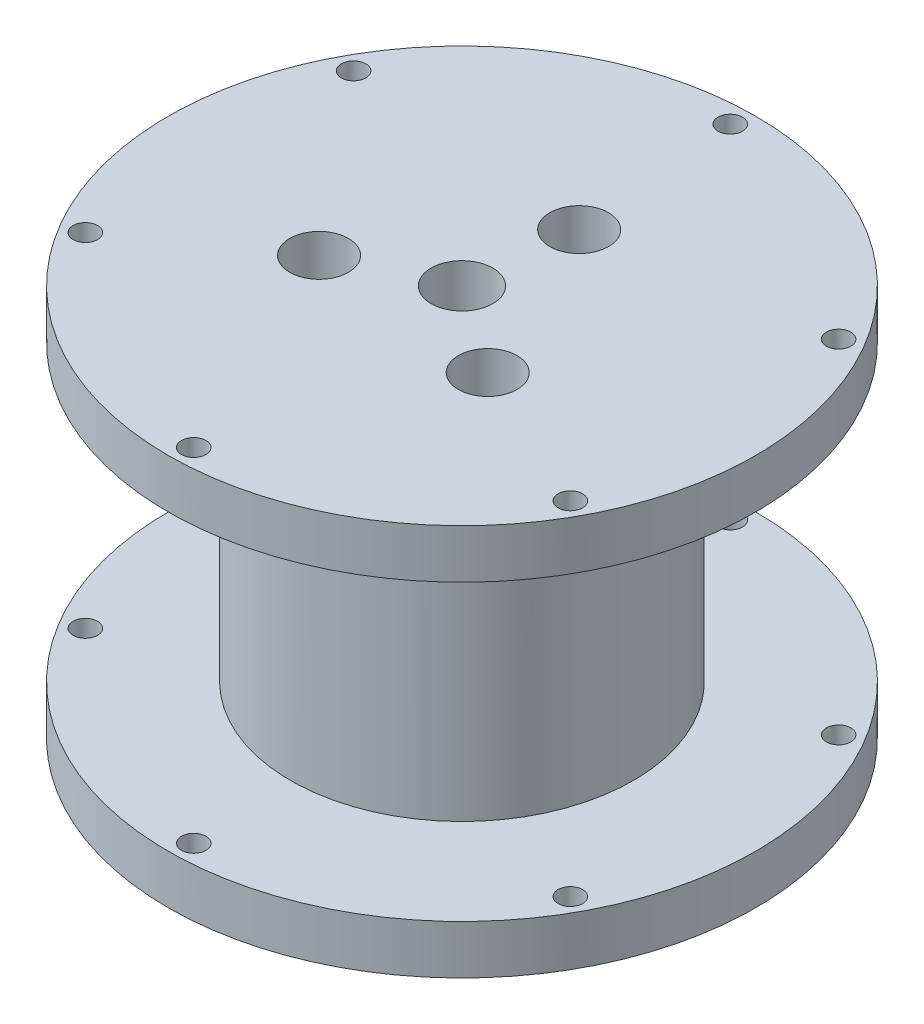
ISO-10303-21;
HEADER;
FILE_DESCRIPTION(('STEP AP214'),'2;1');
FILE_NAME('part.step','',(''),(''),'','','');
FILE_SCHEMA(('AUTOMOTIVE_DESIGN { 1 0 10303 214 1 1 1 1 }'));
ENDSEC;
DATA;
#1=APPLICATION_CONTEXT('core data for automotive mechanical design processes');
#2=APPLICATION_PROTOCOL_DEFINITION('international standard','automotive_design',2000,#1);
#3=PRODUCT_CONTEXT('',#1,'mechanical');
#4=PRODUCT('Part','Part','',(#3));
#5=PRODUCT_RELATED_PRODUCT_CATEGORY('part','',(#4));
#6=PRODUCT_DEFINITION_FORMATION('','',#4);
#7=PRODUCT_DEFINITION_CONTEXT('part definition',#1,'design');
#8=PRODUCT_DEFINITION('design','',#6,#7);
#9=PRODUCT_DEFINITION_SHAPE('','',#8);
#10=(LENGTH_UNIT() NAMED_UNIT(*) SI_UNIT(.MILLI.,.METRE.));
#11=(NAMED_UNIT(*) PLANE_ANGLE_UNIT() SI_UNIT($,.RADIAN.));
#12=(NAMED_UNIT(*) SI_UNIT($,.STERADIAN.) SOLID_ANGLE_UNIT());
#13=UNCERTAINTY_MEASURE_WITH_UNIT(LENGTH_MEASURE(1.E-05),#10,'distance_accuracy_value','');
#14=(GEOMETRIC_REPRESENTATION_CONTEXT(3) GLOBAL_UNCERTAINTY_ASSIGNED_CONTEXT((#13)) GLOBAL_UNIT_ASSIGNED_CONTEXT((#10,
#11,#12)) REPRESENTATION_CONTEXT('',''));
#15=CARTESIAN_POINT('',(0.,0.,0.));
#16=DIRECTION('',(0.,0.,1.));
#17=DIRECTION('',(1.,0.,0.));
#18=AXIS2_PLACEMENT_3D('',#15,#16,#17);
#19=CARTESIAN_POINT('',(0.,40.,0.));
#20=DIRECTION('',(0.,-1.,0.));
#21=DIRECTION('',(0.,0.,-1.));
#22=AXIS2_PLACEMENT_3D('',#19,#20,#21);
#23=CYLINDRICAL_SURFACE('',#22,3.15);
#24=CARTESIAN_POINT('',(0.,40.,0.));
#25=DIRECTION('',(0.,-1.,0.));
#26=DIRECTION('',(0.,0.,-1.));
#27=AXIS2_PLACEMENT_3D('',#24,#25,#26);
#28=CIRCLE('',#27,3.15);
#29=CARTESIAN_POINT('',(0.,40.,-3.15));
#30=VERTEX_POINT('',#29);
#31=EDGE_CURVE('E181',#30,#30,#28,.T.);
#32=ORIENTED_EDGE('',*,*,#31,.F.);
#33=EDGE_LOOP('',(#32));
#34=FACE_BOUND('',#33,.T.);
#35=CARTESIAN_POINT('',(0.,7.5,0.));
#36=DIRECTION('',(0.,-1.,0.));
#37=DIRECTION('',(0.,0.,-1.));
#38=AXIS2_PLACEMENT_3D('',#35,#36,#37);
#39=CIRCLE('',#38,3.15);
#40=CARTESIAN_POINT('',(0.,7.5,-3.15));
#41=VERTEX_POINT('',#40);
#42=EDGE_CURVE('E159',#41,#41,#39,.F.);
#43=ORIENTED_EDGE('',*,*,#42,.F.);
#44=EDGE_LOOP('',(#43));
#45=FACE_BOUND('',#44,.T.);
#46=ADVANCED_FACE('F36',(#34,#45),#23,.F.);
#47=CARTESIAN_POINT('',(0.,40.,0.));
#48=DIRECTION('',(0.,-1.,0.));
#49=DIRECTION('',(0.,0.,-1.));
#50=AXIS2_PLACEMENT_3D('',#47,#48,#49);
#51=CYLINDRICAL_SURFACE('',#50,30.);
#52=CARTESIAN_POINT('',(0.,40.,0.));
#53=DIRECTION('',(0.,1.,0.));
#54=DIRECTION('',(0.,0.,1.));
#55=AXIS2_PLACEMENT_3D('',#52,#53,#54);
#56=CIRCLE('',#55,30.);
#57=CARTESIAN_POINT('',(0.,40.,30.));
#58=VERTEX_POINT('',#57);
#59=EDGE_CURVE('E205',#58,#58,#56,.T.);
#60=ORIENTED_EDGE('',*,*,#59,.F.);
#61=EDGE_LOOP('',(#60));
#62=FACE_BOUND('',#61,.T.);
#63=CARTESIAN_POINT('',(0.,35.,0.));
#64=DIRECTION('',(0.,-1.,0.));
#65=DIRECTION('',(0.,0.,-1.));
#66=AXIS2_PLACEMENT_3D('',#63,#64,#65);
#67=CIRCLE('',#66,30.);
#68=CARTESIAN_POINT('',(0.,35.,-30.));
#69=VERTEX_POINT('',#68);
#70=EDGE_CURVE('E212',#69,#69,#67,.T.);
#71=ORIENTED_EDGE('',*,*,#70,.F.);
#72=EDGE_LOOP('',(#71));
#73=FACE_BOUND('',#72,.T.);
#74=ADVANCED_FACE('F249',(#62,#73),#51,.T.);
#75=CARTESIAN_POINT('',(0.,40.,0.));
#76=DIRECTION('',(0.,1.,0.));
#77=DIRECTION('',(0.,0.,1.));
#78=AXIS2_PLACEMENT_3D('',#75,#76,#77);
#79=PLANE('',#78);
#80=CARTESIAN_POINT('',(23.9426736674736,40.,-14.517175264247));
#81=DIRECTION('',(0.,-1.,0.));
#82=DIRECTION('',(0.,0.,-1.));
#83=AXIS2_PLACEMENT_3D('',#80,#81,#82);
#84=CIRCLE('',#83,1.25);
#85=CARTESIAN_POINT('',(23.9426736674736,40.,-15.767175264247));
#86=VERTEX_POINT('',#85);
#87=EDGE_CURVE('E499',#86,#86,#84,.T.);
#88=ORIENTED_EDGE('',*,*,#87,.T.);
#89=EDGE_LOOP('',(#88));
#90=FACE_BOUND('',#89,.T.);
#91=CARTESIAN_POINT('',(-0.600905736292166,40.,-27.9935512626764));
#92=DIRECTION('',(0.,-1.,0.));
#93=DIRECTION('',(0.,0.,-1.));
#94=AXIS2_PLACEMENT_3D('',#91,#92,#93);
#95=CIRCLE('',#94,1.25);
#96=CARTESIAN_POINT('',(-0.600905736292166,40.,-29.2435512626764));
#97=VERTEX_POINT('',#96);
#98=EDGE_CURVE('E500',#97,#97,#95,.T.);
#99=ORIENTED_EDGE('',*,*,#98,.T.);
#100=EDGE_LOOP('',(#99));
#101=FACE_BOUND('',#100,.T.);
#102=CARTESIAN_POINT('',(-24.5435794037658,40.,-13.4763759984294));
#103=DIRECTION('',(0.,-1.,0.));
#104=DIRECTION('',(0.,0.,-1.));
#105=AXIS2_PLACEMENT_3D('',#102,#103,#104);
#106=CIRCLE('',#105,1.25);
#107=CARTESIAN_POINT('',(-24.5435794037658,40.,-14.7263759984294));
#108=VERTEX_POINT('',#107);
#109=EDGE_CURVE('E503',#108,#108,#106,.T.);
#110=ORIENTED_EDGE('',*,*,#109,.T.);
#111=EDGE_LOOP('',(#110));
#112=FACE_BOUND('',#111,.T.);
#113=CARTESIAN_POINT('',(-23.9426736674736,40.,14.517175264247));
#114=DIRECTION('',(0.,-1.,0.));
#115=DIRECTION('',(0.,0.,-1.));
#116=AXIS2_PLACEMENT_3D('',#113,#114,#115);
#117=CIRCLE('',#116,1.25);
#118=CARTESIAN_POINT('',(-23.9426736674736,40.,13.267175264247));
#119=VERTEX_POINT('',#118);
#120=EDGE_CURVE('E626',#119,#119,#117,.T.);
#121=ORIENTED_EDGE('',*,*,#120,.T.);
#122=EDGE_LOOP('',(#121));
#123=FACE_BOUND('',#122,.T.);
#124=CARTESIAN_POINT('',(0.600905736292153,40.,27.9935512626764));
#125=DIRECTION('',(0.,-1.,0.));
#126=DIRECTION('',(0.,0.,-1.));
#127=AXIS2_PLACEMENT_3D('',#124,#125,#126);
#128=CIRCLE('',#127,1.25);
#129=CARTESIAN_POINT('',(0.600905736292153,40.,26.7435512626764));
#130=VERTEX_POINT('',#129);
#131=EDGE_CURVE('E511',#130,#130,#128,.T.);
#132=ORIENTED_EDGE('',*,*,#131,.T.);
#133=EDGE_LOOP('',(#132));
#134=FACE_BOUND('',#133,.T.);
#135=CARTESIAN_POINT('',(24.5435794037658,40.,13.4763759984294));
#136=DIRECTION('',(0.,-1.,0.));
#137=DIRECTION('',(0.,0.,-1.));
#138=AXIS2_PLACEMENT_3D('',#135,#136,#137);
#139=CIRCLE('',#138,1.25);
#140=CARTESIAN_POINT('',(24.5435794037658,40.,12.2263759984294));
#141=VERTEX_POINT('',#140);
#142=EDGE_CURVE('E507',#141,#141,#139,.T.);
#143=ORIENTED_EDGE('',*,*,#142,.T.);
#144=EDGE_LOOP('',(#143));
#145=FACE_BOUND('',#144,.T.);
#146=CARTESIAN_POINT('',(1.01025077865064,40.,-10.9535105497843));
#147=DIRECTION('',(0.,-1.,0.));
#148=DIRECTION('',(0.,0.,-1.));
#149=AXIS2_PLACEMENT_3D('',#146,#147,#148);
#150=CIRCLE('',#149,3.);
#151=CARTESIAN_POINT('',(1.01025077865064,40.,-13.9535105497843));
#152=VERTEX_POINT('',#151);
#153=EDGE_CURVE('E178',#152,#152,#150,.T.);
#154=ORIENTED_EDGE('',*,*,#153,.T.);
#155=EDGE_LOOP('',(#154));
#156=FACE_BOUND('',#155,.T.);
#157=CARTESIAN_POINT('',(8.98089300740874,40.,6.3516581133966));
#158=DIRECTION('',(0.,-1.,0.));
#159=DIRECTION('',(0.,0.,-1.));
#160=AXIS2_PLACEMENT_3D('',#157,#158,#159);
#161=CIRCLE('',#160,3.);
#162=CARTESIAN_POINT('',(8.98089300740874,40.,3.3516581133966));
#163=VERTEX_POINT('',#162);
#164=EDGE_CURVE('E185',#163,#163,#161,.T.);
#165=ORIENTED_EDGE('',*,*,#164,.T.);
#166=EDGE_LOOP('',(#165));
#167=FACE_BOUND('',#166,.T.);
#168=CARTESIAN_POINT('',(-9.99114378605937,40.,4.60185243638768));
#169=DIRECTION('',(0.,-1.,0.));
#170=DIRECTION('',(0.,0.,-1.));
#171=AXIS2_PLACEMENT_3D('',#168,#169,#170);
#172=CIRCLE('',#171,3.);
#173=CARTESIAN_POINT('',(-9.99114378605937,40.,1.60185243638768));
#174=VERTEX_POINT('',#173);
#175=EDGE_CURVE('E191',#174,#174,#172,.T.);
#176=ORIENTED_EDGE('',*,*,#175,.T.);
#177=EDGE_LOOP('',(#176));
#178=FACE_BOUND('',#177,.T.);
#179=ORIENTED_EDGE('',*,*,#31,.T.);
#180=EDGE_LOOP('',(#179));
#181=FACE_BOUND('',#180,.T.);
#182=ORIENTED_EDGE('',*,*,#59,.T.);
#183=EDGE_LOOP('',(#182));
#184=FACE_BOUND('',#183,.T.);
#185=ADVANCED_FACE('F242',(#90,#101,#112,#123,#134,#145,#156,#167,#178,#181,#184),#79,.T.);
#186=CARTESIAN_POINT('',(0.,35.,0.));
#187=DIRECTION('',(0.,-1.,0.));
#188=DIRECTION('',(0.,0.,-1.));
#189=AXIS2_PLACEMENT_3D('',#186,#187,#188);
#190=PLANE('',#189);
#191=CARTESIAN_POINT('',(23.9426736674736,35.,-14.517175264247));
#192=DIRECTION('',(0.,-1.,0.));
#193=DIRECTION('',(0.,0.,-1.));
#194=AXIS2_PLACEMENT_3D('',#191,#192,#193);
#195=CIRCLE('',#194,1.25);
#196=CARTESIAN_POINT('',(23.9426736674736,35.,-15.767175264247));
#197=VERTEX_POINT('',#196);
#198=EDGE_CURVE('E136',#197,#197,#195,.T.);
#199=ORIENTED_EDGE('',*,*,#198,.F.);
#200=EDGE_LOOP('',(#199));
#201=FACE_BOUND('',#200,.T.);
#202=CARTESIAN_POINT('',(-0.600905736292166,35.,-27.9935512626764));
#203=DIRECTION('',(0.,-1.,0.));
#204=DIRECTION('',(0.,0.,-1.));
#205=AXIS2_PLACEMENT_3D('',#202,#203,#204);
#206=CIRCLE('',#205,1.25);
#207=CARTESIAN_POINT('',(-0.600905736292166,35.,-29.2435512626764));
#208=VERTEX_POINT('',#207);
#209=EDGE_CURVE('E543',#208,#208,#206,.T.);
#210=ORIENTED_EDGE('',*,*,#209,.F.);
#211=EDGE_LOOP('',(#210));
#212=FACE_BOUND('',#211,.T.);
#213=CARTESIAN_POINT('',(-24.5435794037658,35.,-13.4763759984294));
#214=DIRECTION('',(0.,-1.,0.));
#215=DIRECTION('',(0.,0.,-1.));
#216=AXIS2_PLACEMENT_3D('',#213,#214,#215);
#217=CIRCLE('',#216,1.25);
#218=CARTESIAN_POINT('',(-24.5435794037658,35.,-14.7263759984294));
#219=VERTEX_POINT('',#218);
#220=EDGE_CURVE('E536',#219,#219,#217,.T.);
#221=ORIENTED_EDGE('',*,*,#220,.F.);
#222=EDGE_LOOP('',(#221));
#223=FACE_BOUND('',#222,.T.);
#224=CARTESIAN_POINT('',(-23.9426736674736,35.,14.517175264247));
#225=DIRECTION('',(0.,-1.,0.));
#226=DIRECTION('',(0.,0.,-1.));
#227=AXIS2_PLACEMENT_3D('',#224,#225,#226);
#228=CIRCLE('',#227,1.25);
#229=CARTESIAN_POINT('',(-23.9426736674736,35.,13.267175264247));
#230=VERTEX_POINT('',#229);
#231=EDGE_CURVE('E529',#230,#230,#228,.T.);
#232=ORIENTED_EDGE('',*,*,#231,.F.);
#233=EDGE_LOOP('',(#232));
#234=FACE_BOUND('',#233,.T.);
#235=CARTESIAN_POINT('',(0.600905736292153,35.,27.9935512626764));
#236=DIRECTION('',(0.,-1.,0.));
#237=DIRECTION('',(0.,0.,-1.));
#238=AXIS2_PLACEMENT_3D('',#235,#236,#237);
#239=CIRCLE('',#238,1.25);
#240=CARTESIAN_POINT('',(0.600905736292153,35.,26.7435512626764));
#241=VERTEX_POINT('',#240);
#242=EDGE_CURVE('E522',#241,#241,#239,.T.);
#243=ORIENTED_EDGE('',*,*,#242,.F.);
#244=EDGE_LOOP('',(#243));
#245=FACE_BOUND('',#244,.T.);
#246=CARTESIAN_POINT('',(24.5435794037658,35.,13.4763759984294));
#247=DIRECTION('',(0.,-1.,0.));
#248=DIRECTION('',(0.,0.,-1.));
#249=AXIS2_PLACEMENT_3D('',#246,#247,#248);
#250=CIRCLE('',#249,1.25);
#251=CARTESIAN_POINT('',(24.5435794037658,35.,12.2263759984294));
#252=VERTEX_POINT('',#251);
#253=EDGE_CURVE('E515',#252,#252,#250,.T.);
#254=ORIENTED_EDGE('',*,*,#253,.F.);
#255=EDGE_LOOP('',(#254));
#256=FACE_BOUND('',#255,.T.);
#257=CARTESIAN_POINT('',(0.,35.,0.));
#258=DIRECTION('',(0.,-1.,0.));
#259=DIRECTION('',(0.,0.,-1.));
#260=AXIS2_PLACEMENT_3D('',#257,#258,#259);
#261=CIRCLE('',#260,17.5);
#262=CARTESIAN_POINT('',(0.,35.,-17.5));
#263=VERTEX_POINT('',#262);
#264=EDGE_CURVE('E199',#263,#263,#261,.T.);
#265=ORIENTED_EDGE('',*,*,#264,.F.);
#266=EDGE_LOOP('',(#265));
#267=FACE_BOUND('',#266,.T.);
#268=ORIENTED_EDGE('',*,*,#70,.T.);
#269=EDGE_LOOP('',(#268));
#270=FACE_BOUND('',#269,.T.);
#271=ADVANCED_FACE('F238',(#201,#212,#223,#234,#245,#256,#267,#270),#190,.T.);
#272=CARTESIAN_POINT('',(0.,5.,0.));
#273=DIRECTION('',(0.,-1.,0.));
#274=DIRECTION('',(0.,0.,-1.));
#275=AXIS2_PLACEMENT_3D('',#272,#273,#274);
#276=PLANE('',#275);
#277=CARTESIAN_POINT('',(23.9426736674736,5.,-14.517175264247));
#278=DIRECTION('',(0.,-1.,0.));
#279=DIRECTION('',(0.,0.,-1.));
#280=AXIS2_PLACEMENT_3D('',#277,#278,#279);
#281=CIRCLE('',#280,1.25);
#282=CARTESIAN_POINT('',(23.9426736674736,5.,-15.767175264247));
#283=VERTEX_POINT('',#282);
#284=EDGE_CURVE('E545',#283,#283,#281,.T.);
#285=ORIENTED_EDGE('',*,*,#284,.T.);
#286=EDGE_LOOP('',(#285));
#287=FACE_BOUND('',#286,.T.);
#288=CARTESIAN_POINT('',(-0.600905736292166,5.,-27.9935512626764));
#289=DIRECTION('',(0.,-1.,0.));
#290=DIRECTION('',(0.,0.,-1.));
#291=AXIS2_PLACEMENT_3D('',#288,#289,#290);
#292=CIRCLE('',#291,1.25);
#293=CARTESIAN_POINT('',(-0.600905736292166,5.,-29.2435512626764));
#294=VERTEX_POINT('',#293);
#295=EDGE_CURVE('E540',#294,#294,#292,.T.);
#296=ORIENTED_EDGE('',*,*,#295,.T.);
#297=EDGE_LOOP('',(#296));
#298=FACE_BOUND('',#297,.T.);
#299=CARTESIAN_POINT('',(-24.5435794037658,5.,-13.4763759984294));
#300=DIRECTION('',(0.,-1.,0.));
#301=DIRECTION('',(0.,0.,-1.));
#302=AXIS2_PLACEMENT_3D('',#299,#300,#301);
#303=CIRCLE('',#302,1.25);
#304=CARTESIAN_POINT('',(-24.5435794037658,5.,-14.7263759984294));
#305=VERTEX_POINT('',#304);
#306=EDGE_CURVE('E533',#305,#305,#303,.T.);
#307=ORIENTED_EDGE('',*,*,#306,.T.);
#308=EDGE_LOOP('',(#307));
#309=FACE_BOUND('',#308,.T.);
#310=CARTESIAN_POINT('',(-23.9426736674736,5.,14.517175264247));
#311=DIRECTION('',(0.,-1.,0.));
#312=DIRECTION('',(0.,0.,-1.));
#313=AXIS2_PLACEMENT_3D('',#310,#311,#312);
#314=CIRCLE('',#313,1.25);
#315=CARTESIAN_POINT('',(-23.9426736674736,5.,13.267175264247));
#316=VERTEX_POINT('',#315);
#317=EDGE_CURVE('E526',#316,#316,#314,.T.);
#318=ORIENTED_EDGE('',*,*,#317,.T.);
#319=EDGE_LOOP('',(#318));
#320=FACE_BOUND('',#319,.T.);
#321=CARTESIAN_POINT('',(0.600905736292153,5.,27.9935512626764));
#322=DIRECTION('',(0.,-1.,0.));
#323=DIRECTION('',(0.,0.,-1.));
#324=AXIS2_PLACEMENT_3D('',#321,#322,#323);
#325=CIRCLE('',#324,1.25);
#326=CARTESIAN_POINT('',(0.600905736292153,5.,26.7435512626764));
#327=VERTEX_POINT('',#326);
#328=EDGE_CURVE('E519',#327,#327,#325,.T.);
#329=ORIENTED_EDGE('',*,*,#328,.T.);
#330=EDGE_LOOP('',(#329));
#331=FACE_BOUND('',#330,.T.);
#332=CARTESIAN_POINT('',(24.5435794037658,5.,13.4763759984294));
#333=DIRECTION('',(0.,-1.,0.));
#334=DIRECTION('',(0.,0.,-1.));
#335=AXIS2_PLACEMENT_3D('',#332,#333,#334);
#336=CIRCLE('',#335,1.25);
#337=CARTESIAN_POINT('',(24.5435794037658,5.,12.2263759984294));
#338=VERTEX_POINT('',#337);
#339=EDGE_CURVE('E512',#338,#338,#336,.T.);
#340=ORIENTED_EDGE('',*,*,#339,.T.);
#341=EDGE_LOOP('',(#340));
#342=FACE_BOUND('',#341,.T.);
#343=CARTESIAN_POINT('',(0.,5.,0.));
#344=DIRECTION('',(0.,-1.,0.));
#345=DIRECTION('',(0.,0.,-1.));
#346=AXIS2_PLACEMENT_3D('',#343,#344,#345);
#347=CIRCLE('',#346,17.5);
#348=CARTESIAN_POINT('',(-14.2785338407005,5.,-10.1179776319169));
#349=VERTEX_POINT('',#348);
#350=CARTESIAN_POINT('',(-16.2005846637719,5.,-6.61748113347961));
#351=VERTEX_POINT('',#350);
#352=EDGE_CURVE('E198',#349,#351,#347,.T.);
#353=ORIENTED_EDGE('',*,*,#352,.T.);
#354=CARTESIAN_POINT('',(-15.3397371273536,5.,-8.42273499901836));
#355=DIRECTION('',(0.,-1.,0.));
#356=DIRECTION('',(0.,0.,-1.));
#357=AXIS2_PLACEMENT_3D('',#354,#355,#356);
#358=CIRCLE('',#357,2.);
#359=EDGE_CURVE('E174',#349,#351,#358,.F.);
#360=ORIENTED_EDGE('',*,*,#359,.F.);
#361=EDGE_LOOP('',(#353,#360));
#362=FACE_BOUND('',#361,.T.);
#363=CARTESIAN_POINT('',(0.,5.,0.));
#364=DIRECTION('',(0.,-1.,0.));
#365=DIRECTION('',(0.,0.,-1.));
#366=AXIS2_PLACEMENT_3D('',#363,#364,#365);
#367=CIRCLE('',#366,30.);
#368=CARTESIAN_POINT('',(0.,5.,-30.));
#369=VERTEX_POINT('',#368);
#370=EDGE_CURVE('E202',#369,#369,#367,.T.);
#371=ORIENTED_EDGE('',*,*,#370,.F.);
#372=EDGE_LOOP('',(#371));
#373=FACE_BOUND('',#372,.T.);
#374=ADVANCED_FACE('F236',(#287,#298,#309,#320,#331,#342,#362,#373),#276,.F.);
#375=CARTESIAN_POINT('',(0.,35.,0.));
#376=DIRECTION('',(0.,-1.,0.));
#377=DIRECTION('',(0.,0.,-1.));
#378=AXIS2_PLACEMENT_3D('',#375,#376,#377);
#379=CYLINDRICAL_SURFACE('',#378,17.5);
#380=DIRECTION('',(0.,-1.,0.));
#381=VECTOR('',#380,1.);
#382=CARTESIAN_POINT('',(-14.2785338407005,20.,-10.1179776319169));
#383=LINE('',#382,#381);
#384=CARTESIAN_POINT('',(-14.2785338407005,6.,-10.1179776319169));
#385=VERTEX_POINT('',#384);
#386=EDGE_CURVE('E169',#349,#385,#383,.F.);
#387=ORIENTED_EDGE('',*,*,#386,.T.);
#388=CARTESIAN_POINT('',(-14.2785338407005,6.,-10.1179776319169));
#389=CARTESIAN_POINT('',(-14.2785327253716,6.0562194883411,-10.1179765012855));
#390=CARTESIAN_POINT('',(-14.2799076295418,6.11241199955088,-10.1160392382119));
#391=CARTESIAN_POINT('',(-14.2853839994859,6.22439403919385,-10.1083053532598));
#392=CARTESIAN_POINT('',(-14.2894853182556,6.28018358919015,-10.1025089394607));
#393=CARTESIAN_POINT('',(-14.3058222436855,6.44624370070353,-10.0793764439415));
#394=CARTESIAN_POINT('',(-14.3220910053981,6.55540055311681,-10.0562969940414));
#395=CARTESIAN_POINT('',(-14.3647097202837,6.76742009712747,-9.99532299312393));
#396=CARTESIAN_POINT('',(-14.391064279592,6.87027988795344,-9.95742167285623));
#397=CARTESIAN_POINT('',(-14.4527574944918,7.06680087859013,-9.86766207144121));
#398=CARTESIAN_POINT('',(-14.4880947788519,7.16046347934816,-9.81580592045649));
#399=CARTESIAN_POINT('',(-14.5663566188937,7.3360168170633,-9.69928705794387));
#400=CARTESIAN_POINT('',(-14.6092872219855,7.41789807625467,-9.63461413400259));
#401=CARTESIAN_POINT('',(-14.701045031153,7.56750609083921,-9.49401423308429));
#402=CARTESIAN_POINT('',(-14.7498733400795,7.63523019240694,-9.41808515063888));
#403=CARTESIAN_POINT('',(-14.8515616068764,7.75456443867903,-9.25689942999778));
#404=CARTESIAN_POINT('',(-14.9044203446804,7.80617943592353,-9.17164561115962));
#405=CARTESIAN_POINT('',(-15.0122848629163,7.89183553562339,-8.99400190153066));
#406=CARTESIAN_POINT('',(-15.0672893259959,7.9258872438194,-8.90161635613762));
#407=CARTESIAN_POINT('',(-15.1588619995994,7.96706730201505,-8.74437871457755));
#408=CARTESIAN_POINT('',(-15.195362587963,7.97940866856579,-8.68080301173116));
#409=CARTESIAN_POINT('',(-15.2679571196282,7.99587444308896,-8.55248315926871));
#410=CARTESIAN_POINT('',(-15.304051544361,8.00000989445048,-8.48774069849978));
#411=CARTESIAN_POINT('',(-15.3397371273536,8.,-8.42273499901836));
#412=B_SPLINE_CURVE_WITH_KNOTS('',3,(#388,#389,#390,#391,#392,#393,#394,#395,#396,#397,#398,
#399,#400,#401,#402,#403,#404,#405,#406,#407,#408,#409,#410,#411),.UNSPECIFIED.,.F.,.F.,(4,2,2,
2,2,2,2,2,2,2,2,4),(0.,0.16855473112019,0.337100374764693,0.673614622449847,1.01028273833459,
1.34689949197511,1.68378554835441,2.02073469908359,2.35758225254909,2.6942261589239,
2.91681308961449,3.13910026266834),.UNSPECIFIED.);
#413=CARTESIAN_POINT('',(-15.3397371273536,8.,-8.42273499901836));
#414=VERTEX_POINT('',#413);
#415=EDGE_CURVE('E46',#385,#414,#412,.T.);
#416=ORIENTED_EDGE('',*,*,#415,.T.);
#417=CARTESIAN_POINT('',(-15.3397371273536,8.,-8.42273499901836));
#418=CARTESIAN_POINT('',(-15.3666892958916,7.99999964414278,-8.37365200479563));
#419=CARTESIAN_POINT('',(-15.3933900093695,7.99764685831645,-8.32446164689033));
#420=CARTESIAN_POINT('',(-15.4461346697476,7.98826078304028,-8.22617935480664));
#421=CARTESIAN_POINT('',(-15.4721786560741,7.98122777526309,-8.17708741488343));
#422=CARTESIAN_POINT('',(-15.5490072452259,7.95317824067768,-8.0305960821633));
#423=CARTESIAN_POINT('',(-15.5985866451037,7.92521099671269,-7.93380215917815));
#424=CARTESIAN_POINT('',(-15.6932391682437,7.85151690268498,-7.74489795589235));
#425=CARTESIAN_POINT('',(-15.7383103611693,7.80578248561243,-7.65278969013413));
#426=CARTESIAN_POINT('',(-15.8230375113524,7.69784791607021,-7.47603447002288));
#427=CARTESIAN_POINT('',(-15.8626941579339,7.63564986254905,-7.39138656638092));
#428=CARTESIAN_POINT('',(-15.9360015932217,7.49638057865078,-7.23198338175992));
#429=CARTESIAN_POINT('',(-15.9696389629215,7.41927689482479,-7.15725029780035));
#430=CARTESIAN_POINT('',(-16.0303494413699,7.25243317085377,-7.02022275394354));
#431=CARTESIAN_POINT('',(-16.0574212766379,7.16269068455681,-6.95793070757913));
#432=CARTESIAN_POINT('',(-16.1047674521599,6.97284990320016,-6.84763397767562));
#433=CARTESIAN_POINT('',(-16.1250226656271,6.87272348343563,-6.79966953766044));
#434=CARTESIAN_POINT('',(-16.1584567854848,6.66516766654066,-6.71983320898704));
#435=CARTESIAN_POINT('',(-16.1716396391145,6.55774238086806,-6.68795234432661));
#436=CARTESIAN_POINT('',(-16.1876936289706,6.3747560162437,-6.64897453266134));
#437=CARTESIAN_POINT('',(-16.1925299341713,6.30032854168021,-6.63717556467603));
#438=CARTESIAN_POINT('',(-16.1989726240992,6.15061109168183,-6.62142776143091));
#439=CARTESIAN_POINT('',(-16.2005833345293,6.0753224077179,-6.61746841288403));
#440=CARTESIAN_POINT('',(-16.2005846637719,6.,-6.61748113347962));
#441=B_SPLINE_CURVE_WITH_KNOTS('',3,(#417,#418,#419,#420,#421,#422,#423,#424,#425,#426,#427,
#428,#429,#430,#431,#432,#433,#434,#435,#436,#437,#438,#439,#440),.UNSPECIFIED.,.F.,.F.,(4,2,2,
2,2,2,2,2,2,2,2,4),(0.,0.167884729659221,0.335759356323115,0.67090392766453,1.00619139328893,
1.34143613369577,1.6774191817537,2.01346734657707,2.35045071818943,2.68724581581267,
2.91332989232799,3.13911057388865),.UNSPECIFIED.);
#442=CARTESIAN_POINT('',(-16.2005846637719,6.,-6.61748113347961));
#443=VERTEX_POINT('',#442);
#444=EDGE_CURVE('E12',#414,#443,#441,.T.);
#445=ORIENTED_EDGE('',*,*,#444,.T.);
#446=DIRECTION('',(0.,-1.,0.));
#447=VECTOR('',#446,1.);
#448=CARTESIAN_POINT('',(-16.2005846637719,20.,-6.61748113347961));
#449=LINE('',#448,#447);
#450=EDGE_CURVE('E167',#443,#351,#449,.T.);
#451=ORIENTED_EDGE('',*,*,#450,.T.);
#452=ORIENTED_EDGE('',*,*,#352,.F.);
#453=EDGE_LOOP('',(#387,#416,#445,#451,#452));
#454=FACE_BOUND('',#453,.T.);
#455=ORIENTED_EDGE('',*,*,#264,.T.);
#456=EDGE_LOOP('',(#455));
#457=FACE_BOUND('',#456,.T.);
#458=ADVANCED_FACE('F230',(#454,#457),#379,.T.);
#459=CARTESIAN_POINT('',(0.,0.,0.));
#460=DIRECTION('',(0.,1.,0.));
#461=DIRECTION('',(0.,0.,1.));
#462=AXIS2_PLACEMENT_3D('',#459,#460,#461);
#463=PLANE('',#462);
#464=CARTESIAN_POINT('',(23.9426736674736,0.,-14.517175264247));
#465=DIRECTION('',(0.,1.,0.));
#466=DIRECTION('',(0.,0.,1.));
#467=AXIS2_PLACEMENT_3D('',#464,#465,#466);
#468=CIRCLE('',#467,1.25);
#469=CARTESIAN_POINT('',(23.9426736674736,0.,-13.267175264247));
#470=VERTEX_POINT('',#469);
#471=EDGE_CURVE('E41',#470,#470,#468,.T.);
#472=ORIENTED_EDGE('',*,*,#471,.T.);
#473=EDGE_LOOP('',(#472));
#474=FACE_BOUND('',#473,.T.);
#475=CARTESIAN_POINT('',(-0.600905736292166,0.,-27.9935512626764));
#476=DIRECTION('',(0.,1.,0.));
#477=DIRECTION('',(0.,0.,1.));
#478=AXIS2_PLACEMENT_3D('',#475,#476,#477);
#479=CIRCLE('',#478,1.25);
#480=CARTESIAN_POINT('',(-0.600905736292166,0.,-26.7435512626764));
#481=VERTEX_POINT('',#480);
#482=EDGE_CURVE('E539',#481,#481,#479,.T.);
#483=ORIENTED_EDGE('',*,*,#482,.T.);
#484=EDGE_LOOP('',(#483));
#485=FACE_BOUND('',#484,.T.);
#486=CARTESIAN_POINT('',(-24.5435794037658,0.,-13.4763759984294));
#487=DIRECTION('',(0.,1.,0.));
#488=DIRECTION('',(0.,0.,1.));
#489=AXIS2_PLACEMENT_3D('',#486,#487,#488);
#490=CIRCLE('',#489,1.25);
#491=CARTESIAN_POINT('',(-24.5435794037658,0.,-12.2263759984294));
#492=VERTEX_POINT('',#491);
#493=EDGE_CURVE('E532',#492,#492,#490,.T.);
#494=ORIENTED_EDGE('',*,*,#493,.T.);
#495=EDGE_LOOP('',(#494));
#496=FACE_BOUND('',#495,.T.);
#497=CARTESIAN_POINT('',(-23.9426736674736,0.,14.517175264247));
#498=DIRECTION('',(0.,1.,0.));
#499=DIRECTION('',(0.,0.,1.));
#500=AXIS2_PLACEMENT_3D('',#497,#498,#499);
#501=CIRCLE('',#500,1.25);
#502=CARTESIAN_POINT('',(-23.9426736674736,0.,15.767175264247));
#503=VERTEX_POINT('',#502);
#504=EDGE_CURVE('E525',#503,#503,#501,.T.);
#505=ORIENTED_EDGE('',*,*,#504,.T.);
#506=EDGE_LOOP('',(#505));
#507=FACE_BOUND('',#506,.T.);
#508=CARTESIAN_POINT('',(0.600905736292153,0.,27.9935512626764));
#509=DIRECTION('',(0.,1.,0.));
#510=DIRECTION('',(0.,0.,1.));
#511=AXIS2_PLACEMENT_3D('',#508,#509,#510);
#512=CIRCLE('',#511,1.25);
#513=CARTESIAN_POINT('',(0.600905736292153,0.,29.2435512626764));
#514=VERTEX_POINT('',#513);
#515=EDGE_CURVE('E518',#514,#514,#512,.T.);
#516=ORIENTED_EDGE('',*,*,#515,.T.);
#517=EDGE_LOOP('',(#516));
#518=FACE_BOUND('',#517,.T.);
#519=CARTESIAN_POINT('',(24.5435794037658,0.,13.4763759984294));
#520=DIRECTION('',(0.,1.,0.));
#521=DIRECTION('',(0.,0.,1.));
#522=AXIS2_PLACEMENT_3D('',#519,#520,#521);
#523=CIRCLE('',#522,1.25);
#524=CARTESIAN_POINT('',(24.5435794037658,0.,14.7263759984294));
#525=VERTEX_POINT('',#524);
#526=EDGE_CURVE('E510',#525,#525,#523,.T.);
#527=ORIENTED_EDGE('',*,*,#526,.T.);
#528=EDGE_LOOP('',(#527));
#529=FACE_BOUND('',#528,.T.);
#530=DIRECTION('',(0.593510029895074,0.,-0.804826592760173));
#531=VECTOR('',#530,1.);
#532=CARTESIAN_POINT('',(-6.3111937255776,0.,-0.708637489527106));
#533=LINE('',#532,#531);
#534=CARTESIAN_POINT('',(-6.3111937255776,0.,-0.708637489527106));
#535=VERTEX_POINT('',#534);
#536=CARTESIAN_POINT('',(-2.5418987947843,0.,-5.81997283931871));
#537=VERTEX_POINT('',#536);
#538=EDGE_CURVE('E147',#535,#537,#533,.T.);
#539=ORIENTED_EDGE('',*,*,#538,.F.);
#540=DIRECTION('',(-0.400245260024045,0.,-0.916408059670082));
#541=VECTOR('',#540,1.);
#542=CARTESIAN_POINT('',(-3.7692949307933,0.,5.1113353497916));
#543=LINE('',#542,#541);
#544=CARTESIAN_POINT('',(-3.7692949307933,0.,5.1113353497916));
#545=VERTEX_POINT('',#544);
#546=EDGE_CURVE('E111',#545,#535,#543,.T.);
#547=ORIENTED_EDGE('',*,*,#546,.F.);
#548=DIRECTION('',(-0.993755289919119,0.,-0.11158146690991));
#549=VECTOR('',#548,1.);
#550=CARTESIAN_POINT('',(2.5418987947843,0.,5.81997283931871));
#551=LINE('',#550,#549);
#552=CARTESIAN_POINT('',(2.5418987947843,0.,5.81997283931871));
#553=VERTEX_POINT('',#552);
#554=EDGE_CURVE('E130',#553,#545,#551,.T.);
#555=ORIENTED_EDGE('',*,*,#554,.F.);
#556=DIRECTION('',(-0.593510029895074,0.,0.804826592760173));
#557=VECTOR('',#556,1.);
#558=CARTESIAN_POINT('',(6.3111937255776,0.,0.708637489527107));
#559=LINE('',#558,#557);
#560=CARTESIAN_POINT('',(6.3111937255776,0.,0.708637489527107));
#561=VERTEX_POINT('',#560);
#562=EDGE_CURVE('E133',#561,#553,#559,.T.);
#563=ORIENTED_EDGE('',*,*,#562,.F.);
#564=DIRECTION('',(0.400245260024045,0.,0.916408059670082));
#565=VECTOR('',#564,1.);
#566=CARTESIAN_POINT('',(3.7692949307933,0.,-5.1113353497916));
#567=LINE('',#566,#565);
#568=CARTESIAN_POINT('',(3.7692949307933,0.,-5.1113353497916));
#569=VERTEX_POINT('',#568);
#570=EDGE_CURVE('E152',#569,#561,#567,.T.);
#571=ORIENTED_EDGE('',*,*,#570,.F.);
#572=DIRECTION('',(0.993755289919119,0.,0.11158146690991));
#573=VECTOR('',#572,1.);
#574=CARTESIAN_POINT('',(-2.5418987947843,0.,-5.81997283931871));
#575=LINE('',#574,#573);
#576=EDGE_CURVE('E149',#537,#569,#575,.T.);
#577=ORIENTED_EDGE('',*,*,#576,.F.);
#578=EDGE_LOOP('',(#539,#547,#555,#563,#571,#577));
#579=FACE_BOUND('',#578,.T.);
#580=CARTESIAN_POINT('',(-15.3397371273536,0.,-8.42273499901836));
#581=DIRECTION('',(0.,1.,0.));
#582=DIRECTION('',(0.,0.,1.));
#583=AXIS2_PLACEMENT_3D('',#580,#581,#582);
#584=CIRCLE('',#583,2.);
#585=CARTESIAN_POINT('',(-15.3397371273536,0.,-6.42273499901836));
#586=VERTEX_POINT('',#585);
#587=EDGE_CURVE('E171',#586,#586,#584,.F.);
#588=ORIENTED_EDGE('',*,*,#587,.F.);
#589=EDGE_LOOP('',(#588));
#590=FACE_BOUND('',#589,.T.);
#591=CARTESIAN_POINT('',(1.01025077865064,0.,-10.9535105497843));
#592=DIRECTION('',(0.,-1.,0.));
#593=DIRECTION('',(0.,0.,-1.));
#594=AXIS2_PLACEMENT_3D('',#591,#592,#593);
#595=CIRCLE('',#594,3.);
#596=CARTESIAN_POINT('',(1.01025077865064,0.,-13.9535105497843));
#597=VERTEX_POINT('',#596);
#598=EDGE_CURVE('E182',#597,#597,#595,.T.);
#599=ORIENTED_EDGE('',*,*,#598,.F.);
#600=EDGE_LOOP('',(#599));
#601=FACE_BOUND('',#600,.T.);
#602=CARTESIAN_POINT('',(8.98089300740874,0.,6.3516581133966));
#603=DIRECTION('',(0.,-1.,0.));
#604=DIRECTION('',(0.,0.,-1.));
#605=AXIS2_PLACEMENT_3D('',#602,#603,#604);
#606=CIRCLE('',#605,3.);
#607=CARTESIAN_POINT('',(8.98089300740874,0.,3.3516581133966));
#608=VERTEX_POINT('',#607);
#609=EDGE_CURVE('E188',#608,#608,#606,.T.);
#610=ORIENTED_EDGE('',*,*,#609,.F.);
#611=EDGE_LOOP('',(#610));
#612=FACE_BOUND('',#611,.T.);
#613=CARTESIAN_POINT('',(-9.99114378605937,0.,4.60185243638768));
#614=DIRECTION('',(0.,-1.,0.));
#615=DIRECTION('',(0.,0.,-1.));
#616=AXIS2_PLACEMENT_3D('',#613,#614,#615);
#617=CIRCLE('',#616,3.);
#618=CARTESIAN_POINT('',(-9.99114378605937,0.,1.60185243638768));
#619=VERTEX_POINT('',#618);
#620=EDGE_CURVE('E177',#619,#619,#617,.T.);
#621=ORIENTED_EDGE('',*,*,#620,.F.);
#622=EDGE_LOOP('',(#621));
#623=FACE_BOUND('',#622,.T.);
#624=CARTESIAN_POINT('',(0.,0.,0.));
#625=DIRECTION('',(0.,1.,0.));
#626=DIRECTION('',(0.,0.,1.));
#627=AXIS2_PLACEMENT_3D('',#624,#625,#626);
#628=CIRCLE('',#627,30.);
#629=CARTESIAN_POINT('',(0.,0.,30.));
#630=VERTEX_POINT('',#629);
#631=EDGE_CURVE('E209',#630,#630,#628,.T.);
#632=ORIENTED_EDGE('',*,*,#631,.F.);
#633=EDGE_LOOP('',(#632));
#634=FACE_BOUND('',#633,.T.);
#635=ADVANCED_FACE('F235',(#474,#485,#496,#507,#518,#529,#579,#590,#601,#612,#623,#634),#463,.F.);
#636=ORIENTED_EDGE('',*,*,#370,.T.);
#637=EDGE_LOOP('',(#636));
#638=FACE_BOUND('',#637,.T.);
#639=ORIENTED_EDGE('',*,*,#631,.T.);
#640=EDGE_LOOP('',(#639));
#641=FACE_BOUND('',#640,.T.);
#642=ADVANCED_FACE('F252',(#638,#641),#51,.T.);
#643=CARTESIAN_POINT('',(-9.99114378605937,40.,4.60185243638768));
#644=DIRECTION('',(0.,-1.,0.));
#645=DIRECTION('',(0.,0.,-1.));
#646=AXIS2_PLACEMENT_3D('',#643,#644,#645);
#647=CYLINDRICAL_SURFACE('',#646,3.);
#648=ORIENTED_EDGE('',*,*,#175,.F.);
#649=EDGE_LOOP('',(#648));
#650=FACE_BOUND('',#649,.T.);
#651=ORIENTED_EDGE('',*,*,#620,.T.);
#652=EDGE_LOOP('',(#651));
#653=FACE_BOUND('',#652,.T.);
#654=ADVANCED_FACE('F255',(#650,#653),#647,.F.);
#655=CARTESIAN_POINT('',(8.98089300740874,40.,6.3516581133966));
#656=DIRECTION('',(0.,-1.,0.));
#657=DIRECTION('',(0.,0.,-1.));
#658=AXIS2_PLACEMENT_3D('',#655,#656,#657);
#659=CYLINDRICAL_SURFACE('',#658,3.);
#660=ORIENTED_EDGE('',*,*,#164,.F.);
#661=EDGE_LOOP('',(#660));
#662=FACE_BOUND('',#661,.T.);
#663=ORIENTED_EDGE('',*,*,#609,.T.);
#664=EDGE_LOOP('',(#663));
#665=FACE_BOUND('',#664,.T.);
#666=ADVANCED_FACE('F260',(#662,#665),#659,.F.);
#667=CARTESIAN_POINT('',(1.01025077865064,40.,-10.9535105497843));
#668=DIRECTION('',(0.,-1.,0.));
#669=DIRECTION('',(0.,0.,-1.));
#670=AXIS2_PLACEMENT_3D('',#667,#668,#669);
#671=CYLINDRICAL_SURFACE('',#670,3.);
#672=ORIENTED_EDGE('',*,*,#153,.F.);
#673=EDGE_LOOP('',(#672));
#674=FACE_BOUND('',#673,.T.);
#675=ORIENTED_EDGE('',*,*,#598,.T.);
#676=EDGE_LOOP('',(#675));
#677=FACE_BOUND('',#676,.T.);
#678=ADVANCED_FACE('F281',(#674,#677),#671,.F.);
#679=CARTESIAN_POINT('',(-15.3397371273536,-0.000999999999999265,-8.42273499901836));
#680=DIRECTION('',(0.,1.,0.));
#681=DIRECTION('',(0.,0.,1.));
#682=AXIS2_PLACEMENT_3D('',#679,#680,#681);
#683=CYLINDRICAL_SURFACE('',#682,2.);
#684=ORIENTED_EDGE('',*,*,#450,.F.);
#685=CARTESIAN_POINT('',(-15.3397371273536,6.,-8.42273499901836));
#686=DIRECTION('',(0.,1.,0.));
#687=DIRECTION('',(0.,0.,1.));
#688=AXIS2_PLACEMENT_3D('',#685,#686,#687);
#689=CIRCLE('',#688,2.);
#690=EDGE_CURVE('E208',#443,#385,#689,.T.);
#691=ORIENTED_EDGE('',*,*,#690,.T.);
#692=ORIENTED_EDGE('',*,*,#386,.F.);
#693=ORIENTED_EDGE('',*,*,#359,.T.);
#694=EDGE_LOOP('',(#684,#691,#692,#693));
#695=FACE_BOUND('',#694,.T.);
#696=ORIENTED_EDGE('',*,*,#587,.T.);
#697=EDGE_LOOP('',(#696));
#698=FACE_BOUND('',#697,.T.);
#699=ADVANCED_FACE('F273',(#695,#698),#683,.F.);
#700=CARTESIAN_POINT('',(0.,7.5,0.));
#701=DIRECTION('',(0.,-1.,0.));
#702=DIRECTION('',(0.,0.,-1.));
#703=AXIS2_PLACEMENT_3D('',#700,#701,#702);
#704=PLANE('',#703);
#705=DIRECTION('',(-0.400245260024045,0.,-0.916408059670082));
#706=VECTOR('',#705,1.);
#707=CARTESIAN_POINT('',(-3.7692949307933,7.5,5.1113353497916));
#708=LINE('',#707,#706);
#709=CARTESIAN_POINT('',(-3.7692949307933,7.5,5.1113353497916));
#710=VERTEX_POINT('',#709);
#711=CARTESIAN_POINT('',(-6.3111937255776,7.5,-0.708637489527106));
#712=VERTEX_POINT('',#711);
#713=EDGE_CURVE('E108',#710,#712,#708,.T.);
#714=ORIENTED_EDGE('',*,*,#713,.T.);
#715=DIRECTION('',(0.593510029895074,0.,-0.804826592760173));
#716=VECTOR('',#715,1.);
#717=CARTESIAN_POINT('',(-6.3111937255776,7.5,-0.708637489527106));
#718=LINE('',#717,#716);
#719=CARTESIAN_POINT('',(-2.5418987947843,7.5,-5.81997283931871));
#720=VERTEX_POINT('',#719);
#721=EDGE_CURVE('E119',#712,#720,#718,.T.);
#722=ORIENTED_EDGE('',*,*,#721,.T.);
#723=DIRECTION('',(0.993755289919119,0.,0.11158146690991));
#724=VECTOR('',#723,1.);
#725=CARTESIAN_POINT('',(-2.5418987947843,7.5,-5.81997283931871));
#726=LINE('',#725,#724);
#727=CARTESIAN_POINT('',(3.7692949307933,7.5,-5.1113353497916));
#728=VERTEX_POINT('',#727);
#729=EDGE_CURVE('E124',#720,#728,#726,.T.);
#730=ORIENTED_EDGE('',*,*,#729,.T.);
#731=DIRECTION('',(0.400245260024045,0.,0.916408059670082));
#732=VECTOR('',#731,1.);
#733=CARTESIAN_POINT('',(3.7692949307933,7.5,-5.1113353497916));
#734=LINE('',#733,#732);
#735=CARTESIAN_POINT('',(6.3111937255776,7.5,0.708637489527107));
#736=VERTEX_POINT('',#735);
#737=EDGE_CURVE('E140',#728,#736,#734,.T.);
#738=ORIENTED_EDGE('',*,*,#737,.T.);
#739=DIRECTION('',(-0.593510029895074,0.,0.804826592760173));
#740=VECTOR('',#739,1.);
#741=CARTESIAN_POINT('',(6.3111937255776,7.5,0.708637489527107));
#742=LINE('',#741,#740);
#743=CARTESIAN_POINT('',(2.5418987947843,7.5,5.81997283931871));
#744=VERTEX_POINT('',#743);
#745=EDGE_CURVE('E143',#736,#744,#742,.T.);
#746=ORIENTED_EDGE('',*,*,#745,.T.);
#747=DIRECTION('',(-0.993755289919119,0.,-0.11158146690991));
#748=VECTOR('',#747,1.);
#749=CARTESIAN_POINT('',(2.5418987947843,7.5,5.81997283931871));
#750=LINE('',#749,#748);
#751=EDGE_CURVE('E116',#744,#710,#750,.T.);
#752=ORIENTED_EDGE('',*,*,#751,.T.);
#753=EDGE_LOOP('',(#714,#722,#730,#738,#746,#752));
#754=FACE_BOUND('',#753,.T.);
#755=ORIENTED_EDGE('',*,*,#42,.T.);
#756=EDGE_LOOP('',(#755));
#757=FACE_BOUND('',#756,.T.);
#758=ADVANCED_FACE('F126',(#754,#757),#704,.T.);
#759=CARTESIAN_POINT('',(-3.7692949307933,7.5,5.1113353497916));
#760=DIRECTION('',(-0.916408059670082,0.,0.400245260024045));
#761=DIRECTION('',(0.400245260024045,0.,0.916408059670082));
#762=AXIS2_PLACEMENT_3D('',#759,#760,#761);
#763=PLANE('',#762);
#764=ORIENTED_EDGE('',*,*,#546,.T.);
#765=DIRECTION('',(0.,-1.,0.));
#766=VECTOR('',#765,1.);
#767=CARTESIAN_POINT('',(-6.3111937255776,7.5,-0.708637489527106));
#768=LINE('',#767,#766);
#769=EDGE_CURVE('E104',#712,#535,#768,.T.);
#770=ORIENTED_EDGE('',*,*,#769,.F.);
#771=ORIENTED_EDGE('',*,*,#713,.F.);
#772=DIRECTION('',(0.,-1.,0.));
#773=VECTOR('',#772,1.);
#774=CARTESIAN_POINT('',(-3.7692949307933,7.5,5.1113353497916));
#775=LINE('',#774,#773);
#776=EDGE_CURVE('E157',#710,#545,#775,.T.);
#777=ORIENTED_EDGE('',*,*,#776,.T.);
#778=EDGE_LOOP('',(#764,#770,#771,#777));
#779=FACE_BOUND('',#778,.T.);
#780=ADVANCED_FACE('F106',(#779),#763,.F.);
#781=CARTESIAN_POINT('',(2.5418987947843,7.5,5.81997283931871));
#782=DIRECTION('',(-0.11158146690991,0.,0.993755289919119));
#783=DIRECTION('',(0.993755289919119,0.,0.11158146690991));
#784=AXIS2_PLACEMENT_3D('',#781,#782,#783);
#785=PLANE('',#784);
#786=ORIENTED_EDGE('',*,*,#554,.T.);
#787=ORIENTED_EDGE('',*,*,#776,.F.);
#788=ORIENTED_EDGE('',*,*,#751,.F.);
#789=DIRECTION('',(0.,-1.,0.));
#790=VECTOR('',#789,1.);
#791=CARTESIAN_POINT('',(2.5418987947843,7.5,5.81997283931871));
#792=LINE('',#791,#790);
#793=EDGE_CURVE('E160',#744,#553,#792,.T.);
#794=ORIENTED_EDGE('',*,*,#793,.T.);
#795=EDGE_LOOP('',(#786,#787,#788,#794));
#796=FACE_BOUND('',#795,.T.);
#797=ADVANCED_FACE('F279',(#796),#785,.F.);
#798=CARTESIAN_POINT('',(6.3111937255776,7.5,0.708637489527107));
#799=DIRECTION('',(0.804826592760173,0.,0.593510029895074));
#800=DIRECTION('',(0.593510029895074,0.,-0.804826592760173));
#801=AXIS2_PLACEMENT_3D('',#798,#799,#800);
#802=PLANE('',#801);
#803=ORIENTED_EDGE('',*,*,#562,.T.);
#804=ORIENTED_EDGE('',*,*,#793,.F.);
#805=ORIENTED_EDGE('',*,*,#745,.F.);
#806=DIRECTION('',(0.,-1.,0.));
#807=VECTOR('',#806,1.);
#808=CARTESIAN_POINT('',(6.3111937255776,7.5,0.708637489527107));
#809=LINE('',#808,#807);
#810=EDGE_CURVE('E162',#736,#561,#809,.T.);
#811=ORIENTED_EDGE('',*,*,#810,.T.);
#812=EDGE_LOOP('',(#803,#804,#805,#811));
#813=FACE_BOUND('',#812,.T.);
#814=ADVANCED_FACE('F290',(#813),#802,.F.);
#815=CARTESIAN_POINT('',(3.7692949307933,7.5,-5.1113353497916));
#816=DIRECTION('',(0.916408059670082,0.,-0.400245260024045));
#817=DIRECTION('',(-0.400245260024045,0.,-0.916408059670082));
#818=AXIS2_PLACEMENT_3D('',#815,#816,#817);
#819=PLANE('',#818);
#820=ORIENTED_EDGE('',*,*,#570,.T.);
#821=ORIENTED_EDGE('',*,*,#810,.F.);
#822=ORIENTED_EDGE('',*,*,#737,.F.);
#823=DIRECTION('',(0.,-1.,0.));
#824=VECTOR('',#823,1.);
#825=CARTESIAN_POINT('',(3.7692949307933,7.5,-5.1113353497916));
#826=LINE('',#825,#824);
#827=EDGE_CURVE('E164',#728,#569,#826,.T.);
#828=ORIENTED_EDGE('',*,*,#827,.T.);
#829=EDGE_LOOP('',(#820,#821,#822,#828));
#830=FACE_BOUND('',#829,.T.);
#831=ADVANCED_FACE('F294',(#830),#819,.F.);
#832=CARTESIAN_POINT('',(-2.5418987947843,7.5,-5.81997283931871));
#833=DIRECTION('',(0.11158146690991,0.,-0.993755289919119));
#834=DIRECTION('',(-0.993755289919119,0.,-0.11158146690991));
#835=AXIS2_PLACEMENT_3D('',#832,#833,#834);
#836=PLANE('',#835);
#837=ORIENTED_EDGE('',*,*,#576,.T.);
#838=ORIENTED_EDGE('',*,*,#827,.F.);
#839=ORIENTED_EDGE('',*,*,#729,.F.);
#840=DIRECTION('',(0.,-1.,0.));
#841=VECTOR('',#840,1.);
#842=CARTESIAN_POINT('',(-2.5418987947843,7.5,-5.81997283931871));
#843=LINE('',#842,#841);
#844=EDGE_CURVE('E115',#720,#537,#843,.T.);
#845=ORIENTED_EDGE('',*,*,#844,.T.);
#846=EDGE_LOOP('',(#837,#838,#839,#845));
#847=FACE_BOUND('',#846,.T.);
#848=ADVANCED_FACE('F298',(#847),#836,.F.);
#849=CARTESIAN_POINT('',(-6.3111937255776,7.5,-0.708637489527106));
#850=DIRECTION('',(-0.804826592760173,0.,-0.593510029895074));
#851=DIRECTION('',(-0.593510029895074,0.,0.804826592760173));
#852=AXIS2_PLACEMENT_3D('',#849,#850,#851);
#853=PLANE('',#852);
#854=ORIENTED_EDGE('',*,*,#538,.T.);
#855=ORIENTED_EDGE('',*,*,#844,.F.);
#856=ORIENTED_EDGE('',*,*,#721,.F.);
#857=ORIENTED_EDGE('',*,*,#769,.T.);
#858=EDGE_LOOP('',(#854,#855,#856,#857));
#859=FACE_BOUND('',#858,.T.);
#860=ADVANCED_FACE('F120',(#859),#853,.F.);
#861=CARTESIAN_POINT('',(-15.3397371273536,6.,-8.42273499901836));
#862=DIRECTION('',(0.,1.,0.));
#863=DIRECTION('',(0.,0.,1.));
#864=AXIS2_PLACEMENT_3D('',#861,#862,#863);
#865=SPHERICAL_SURFACE('',#864,2.);
#866=ORIENTED_EDGE('',*,*,#690,.F.);
#867=ORIENTED_EDGE('',*,*,#444,.F.);
#868=ORIENTED_EDGE('',*,*,#415,.F.);
#869=EDGE_LOOP('',(#866,#867,#868));
#870=FACE_BOUND('',#869,.T.);
#871=ADVANCED_FACE('F38',(#870),#865,.F.);
#872=CARTESIAN_POINT('',(24.5435794037658,40.,13.4763759984294));
#873=DIRECTION('',(0.,-1.,0.));
#874=DIRECTION('',(0.,0.,-1.));
#875=AXIS2_PLACEMENT_3D('',#872,#873,#874);
#876=CYLINDRICAL_SURFACE('',#875,1.25);
#877=ORIENTED_EDGE('',*,*,#526,.F.);
#878=EDGE_LOOP('',(#877));
#879=FACE_BOUND('',#878,.T.);
#880=ORIENTED_EDGE('',*,*,#339,.F.);
#881=EDGE_LOOP('',(#880));
#882=FACE_BOUND('',#881,.T.);
#883=ADVANCED_FACE('F286',(#879,#882),#876,.F.);
#884=CARTESIAN_POINT('',(0.600905736292153,40.,27.9935512626764));
#885=DIRECTION('',(0.,-1.,0.));
#886=DIRECTION('',(0.,0.,-1.));
#887=AXIS2_PLACEMENT_3D('',#884,#885,#886);
#888=CYLINDRICAL_SURFACE('',#887,1.25);
#889=ORIENTED_EDGE('',*,*,#515,.F.);
#890=EDGE_LOOP('',(#889));
#891=FACE_BOUND('',#890,.T.);
#892=ORIENTED_EDGE('',*,*,#328,.F.);
#893=EDGE_LOOP('',(#892));
#894=FACE_BOUND('',#893,.T.);
#895=ADVANCED_FACE('F388',(#891,#894),#888,.F.);
#896=CARTESIAN_POINT('',(-23.9426736674736,40.,14.517175264247));
#897=DIRECTION('',(0.,-1.,0.));
#898=DIRECTION('',(0.,0.,-1.));
#899=AXIS2_PLACEMENT_3D('',#896,#897,#898);
#900=CYLINDRICAL_SURFACE('',#899,1.25);
#901=ORIENTED_EDGE('',*,*,#504,.F.);
#902=EDGE_LOOP('',(#901));
#903=FACE_BOUND('',#902,.T.);
#904=ORIENTED_EDGE('',*,*,#317,.F.);
#905=EDGE_LOOP('',(#904));
#906=FACE_BOUND('',#905,.T.);
#907=ADVANCED_FACE('F398',(#903,#906),#900,.F.);
#908=CARTESIAN_POINT('',(-24.5435794037658,40.,-13.4763759984294));
#909=DIRECTION('',(0.,-1.,0.));
#910=DIRECTION('',(0.,0.,-1.));
#911=AXIS2_PLACEMENT_3D('',#908,#909,#910);
#912=CYLINDRICAL_SURFACE('',#911,1.25);
#913=ORIENTED_EDGE('',*,*,#493,.F.);
#914=EDGE_LOOP('',(#913));
#915=FACE_BOUND('',#914,.T.);
#916=ORIENTED_EDGE('',*,*,#306,.F.);
#917=EDGE_LOOP('',(#916));
#918=FACE_BOUND('',#917,.T.);
#919=ADVANCED_FACE('F409',(#915,#918),#912,.F.);
#920=CARTESIAN_POINT('',(-0.600905736292166,40.,-27.9935512626764));
#921=DIRECTION('',(0.,-1.,0.));
#922=DIRECTION('',(0.,0.,-1.));
#923=AXIS2_PLACEMENT_3D('',#920,#921,#922);
#924=CYLINDRICAL_SURFACE('',#923,1.25);
#925=ORIENTED_EDGE('',*,*,#482,.F.);
#926=EDGE_LOOP('',(#925));
#927=FACE_BOUND('',#926,.T.);
#928=ORIENTED_EDGE('',*,*,#295,.F.);
#929=EDGE_LOOP('',(#928));
#930=FACE_BOUND('',#929,.T.);
#931=ADVANCED_FACE('F420',(#927,#930),#924,.F.);
#932=CARTESIAN_POINT('',(23.9426736674736,40.,-14.517175264247));
#933=DIRECTION('',(0.,-1.,0.));
#934=DIRECTION('',(0.,0.,-1.));
#935=AXIS2_PLACEMENT_3D('',#932,#933,#934);
#936=CYLINDRICAL_SURFACE('',#935,1.25);
#937=ORIENTED_EDGE('',*,*,#471,.F.);
#938=EDGE_LOOP('',(#937));
#939=FACE_BOUND('',#938,.T.);
#940=ORIENTED_EDGE('',*,*,#284,.F.);
#941=EDGE_LOOP('',(#940));
#942=FACE_BOUND('',#941,.T.);
#943=ADVANCED_FACE('F431',(#939,#942),#936,.F.);
#944=ORIENTED_EDGE('',*,*,#253,.T.);
#945=EDGE_LOOP('',(#944));
#946=FACE_BOUND('',#945,.T.);
#947=ORIENTED_EDGE('',*,*,#142,.F.);
#948=EDGE_LOOP('',(#947));
#949=FACE_BOUND('',#948,.T.);
#950=ADVANCED_FACE('F390',(#946,#949),#876,.F.);
#951=ORIENTED_EDGE('',*,*,#242,.T.);
#952=EDGE_LOOP('',(#951));
#953=FACE_BOUND('',#952,.T.);
#954=ORIENTED_EDGE('',*,*,#131,.F.);
#955=EDGE_LOOP('',(#954));
#956=FACE_BOUND('',#955,.T.);
#957=ADVANCED_FACE('F401',(#953,#956),#888,.F.);
#958=ORIENTED_EDGE('',*,*,#231,.T.);
#959=EDGE_LOOP('',(#958));
#960=FACE_BOUND('',#959,.T.);
#961=ORIENTED_EDGE('',*,*,#120,.F.);
#962=EDGE_LOOP('',(#961));
#963=FACE_BOUND('',#962,.T.);
#964=ADVANCED_FACE('F412',(#960,#963),#900,.F.);
#965=ORIENTED_EDGE('',*,*,#220,.T.);
#966=EDGE_LOOP('',(#965));
#967=FACE_BOUND('',#966,.T.);
#968=ORIENTED_EDGE('',*,*,#109,.F.);
#969=EDGE_LOOP('',(#968));
#970=FACE_BOUND('',#969,.T.);
#971=ADVANCED_FACE('F423',(#967,#970),#912,.F.);
#972=ORIENTED_EDGE('',*,*,#209,.T.);
#973=EDGE_LOOP('',(#972));
#974=FACE_BOUND('',#973,.T.);
#975=ORIENTED_EDGE('',*,*,#98,.F.);
#976=EDGE_LOOP('',(#975));
#977=FACE_BOUND('',#976,.T.);
#978=ADVANCED_FACE('F434',(#974,#977),#924,.F.);
#979=ORIENTED_EDGE('',*,*,#198,.T.);
#980=EDGE_LOOP('',(#979));
#981=FACE_BOUND('',#980,.T.);
#982=ORIENTED_EDGE('',*,*,#87,.F.);
#983=EDGE_LOOP('',(#982));
#984=FACE_BOUND('',#983,.T.);
#985=ADVANCED_FACE('F443',(#981,#984),#936,.F.);
#986=CLOSED_SHELL('',(#46,#74,#185,#271,#374,#458,#635,#642,#654,#666,#678,#699,#758,#780,#797,
#814,#831,#848,#860,#871,#883,#895,#907,#919,#931,#943,#950,#957,#964,#971,#978,#985));
#987=MANIFOLD_SOLID_BREP('B2',#986);
#988=ADVANCED_BREP_SHAPE_REPRESENTATION('',(#18,#987),#14);
#989=SHAPE_DEFINITION_REPRESENTATION(#9,#988);
ENDSEC;
END-ISO-10303-21;
